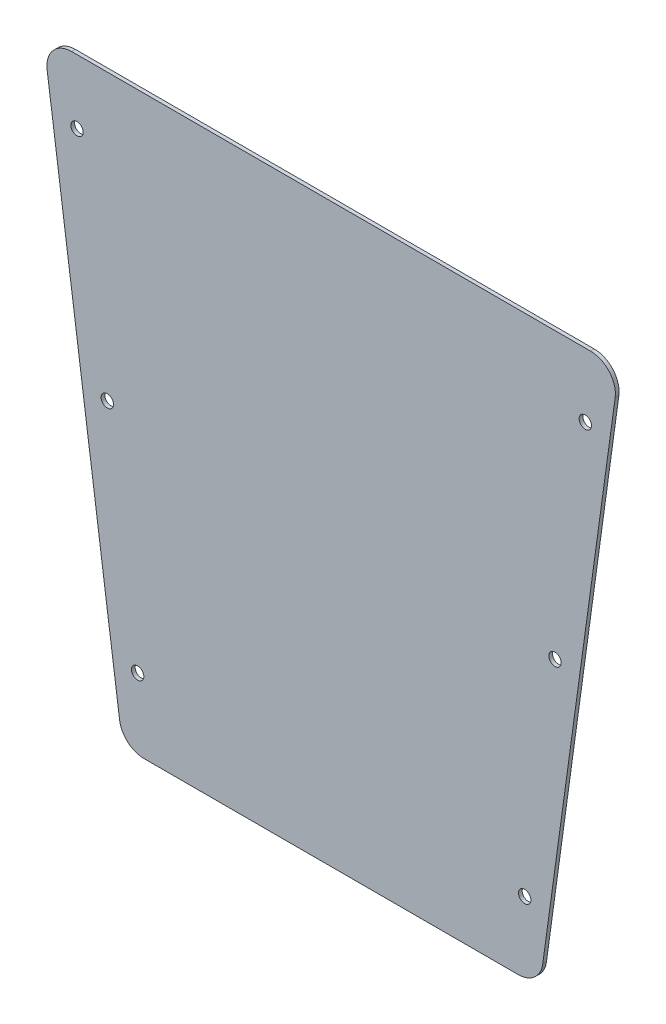
ISO-10303-21;
HEADER;
FILE_DESCRIPTION(('STEP AP214'),'2;1');
FILE_NAME('part.step','',(''),(''),'','','');
FILE_SCHEMA(('AUTOMOTIVE_DESIGN { 1 0 10303 214 1 1 1 1 }'));
ENDSEC;
DATA;
#1=APPLICATION_CONTEXT('core data for automotive mechanical design processes');
#2=APPLICATION_PROTOCOL_DEFINITION('international standard','automotive_design',2000,#1);
#3=PRODUCT_CONTEXT('',#1,'mechanical');
#4=PRODUCT('Part','Part','',(#3));
#5=PRODUCT_RELATED_PRODUCT_CATEGORY('part','',(#4));
#6=PRODUCT_DEFINITION_FORMATION('','',#4);
#7=PRODUCT_DEFINITION_CONTEXT('part definition',#1,'design');
#8=PRODUCT_DEFINITION('design','',#6,#7);
#9=PRODUCT_DEFINITION_SHAPE('','',#8);
#10=(LENGTH_UNIT() NAMED_UNIT(*) SI_UNIT(.MILLI.,.METRE.));
#11=(NAMED_UNIT(*) PLANE_ANGLE_UNIT() SI_UNIT($,.RADIAN.));
#12=(NAMED_UNIT(*) SI_UNIT($,.STERADIAN.) SOLID_ANGLE_UNIT());
#13=UNCERTAINTY_MEASURE_WITH_UNIT(LENGTH_MEASURE(1.E-05),#10,'distance_accuracy_value','');
#14=(GEOMETRIC_REPRESENTATION_CONTEXT(3) GLOBAL_UNCERTAINTY_ASSIGNED_CONTEXT((#13)) GLOBAL_UNIT_ASSIGNED_CONTEXT((#10,
#11,#12)) REPRESENTATION_CONTEXT('',''));
#15=CARTESIAN_POINT('',(0.,0.,0.));
#16=DIRECTION('',(0.,0.,1.));
#17=DIRECTION('',(1.,0.,0.));
#18=AXIS2_PLACEMENT_3D('',#15,#16,#17);
#19=CARTESIAN_POINT('',(84.3502994281403,-287.658470613836,-1.5));
#20=DIRECTION('',(0.990676879065413,-0.1362325999356,0.));
#21=DIRECTION('',(0.1362325999356,0.990676879065413,0.));
#22=AXIS2_PLACEMENT_3D('',#19,#20,#21);
#23=PLANE('',#22);
#24=DIRECTION('',(0.1362325999356,0.990676879065413,0.));
#25=VECTOR('',#24,1.);
#26=CARTESIAN_POINT('',(84.3502994281403,-287.658470613836,0.));
#27=LINE('',#26,#25);
#28=CARTESIAN_POINT('',(85.5381062815857,-279.020796613192,0.));
#29=VERTEX_POINT('',#28);
#30=CARTESIAN_POINT('',(114.81882264673,-66.0928431047569,0.));
#31=VERTEX_POINT('',#30);
#32=EDGE_CURVE('E204',#29,#31,#27,.T.);
#33=ORIENTED_EDGE('',*,*,#32,.F.);
#34=DIRECTION('',(0.,0.,1.));
#35=VECTOR('',#34,1.);
#36=CARTESIAN_POINT('',(85.5381062815857,-279.020796613192,-1.5));
#37=LINE('',#36,#35);
#38=CARTESIAN_POINT('',(85.5381062815857,-279.020796613192,-1.5));
#39=VERTEX_POINT('',#38);
#40=EDGE_CURVE('E158',#29,#39,#37,.F.);
#41=ORIENTED_EDGE('',*,*,#40,.T.);
#42=DIRECTION('',(0.1362325999356,0.990676879065413,0.));
#43=VECTOR('',#42,1.);
#44=CARTESIAN_POINT('',(84.3502994281403,-287.658470613836,-1.5));
#45=LINE('',#44,#43);
#46=CARTESIAN_POINT('',(114.81882264673,-66.0928431047569,-1.5));
#47=VERTEX_POINT('',#46);
#48=EDGE_CURVE('E131',#39,#47,#45,.T.);
#49=ORIENTED_EDGE('',*,*,#48,.T.);
#50=DIRECTION('',(0.,0.,1.));
#51=VECTOR('',#50,1.);
#52=CARTESIAN_POINT('',(114.81882264673,-66.0928431047568,-1.5));
#53=LINE('',#52,#51);
#54=EDGE_CURVE('E154',#47,#31,#53,.T.);
#55=ORIENTED_EDGE('',*,*,#54,.T.);
#56=EDGE_LOOP('',(#33,#41,#49,#55));
#57=FACE_BOUND('',#56,.T.);
#58=ADVANCED_FACE('F41',(#57),#23,.T.);
#59=CARTESIAN_POINT('',(-84.3502994281402,-287.658470613836,-1.5));
#60=DIRECTION('',(0.,-1.,0.));
#61=DIRECTION('',(0.,0.,-1.));
#62=AXIS2_PLACEMENT_3D('',#59,#60,#61);
#63=PLANE('',#62);
#64=DIRECTION('',(1.,0.,0.));
#65=VECTOR('',#64,1.);
#66=CARTESIAN_POINT('',(-84.3502994281402,-287.658470613836,-1.5));
#67=LINE('',#66,#65);
#68=CARTESIAN_POINT('',(-75.6313374909316,-287.658470613836,-1.5));
#69=VERTEX_POINT('',#68);
#70=CARTESIAN_POINT('',(75.6313374909316,-287.658470613836,-1.5));
#71=VERTEX_POINT('',#70);
#72=EDGE_CURVE('E137',#69,#71,#67,.T.);
#73=ORIENTED_EDGE('',*,*,#72,.T.);
#74=DIRECTION('',(0.,0.,1.));
#75=VECTOR('',#74,1.);
#76=CARTESIAN_POINT('',(75.6313374909316,-287.658470613836,-1.5));
#77=LINE('',#76,#75);
#78=CARTESIAN_POINT('',(75.6313374909316,-287.658470613836,0.));
#79=VERTEX_POINT('',#78);
#80=EDGE_CURVE('E129',#71,#79,#77,.T.);
#81=ORIENTED_EDGE('',*,*,#80,.T.);
#82=DIRECTION('',(1.,0.,0.));
#83=VECTOR('',#82,1.);
#84=CARTESIAN_POINT('',(-84.3502994281402,-287.658470613836,0.));
#85=LINE('',#84,#83);
#86=CARTESIAN_POINT('',(-75.6313374909316,-287.658470613836,0.));
#87=VERTEX_POINT('',#86);
#88=EDGE_CURVE('E111',#87,#79,#85,.T.);
#89=ORIENTED_EDGE('',*,*,#88,.F.);
#90=DIRECTION('',(0.,0.,1.));
#91=VECTOR('',#90,1.);
#92=CARTESIAN_POINT('',(-75.6313374909316,-287.658470613836,-1.5));
#93=LINE('',#92,#91);
#94=EDGE_CURVE('E126',#87,#69,#93,.F.);
#95=ORIENTED_EDGE('',*,*,#94,.T.);
#96=EDGE_LOOP('',(#73,#81,#89,#95));
#97=FACE_BOUND('',#96,.T.);
#98=ADVANCED_FACE('F125',(#97),#63,.T.);
#99=CARTESIAN_POINT('',(-116.381309109186,-54.7305171054008,-1.5));
#100=DIRECTION('',(-0.990676879065413,-0.1362325999356,0.));
#101=DIRECTION('',(0.1362325999356,-0.990676879065413,0.));
#102=AXIS2_PLACEMENT_3D('',#99,#100,#101);
#103=PLANE('',#102);
#104=DIRECTION('',(0.1362325999356,-0.990676879065413,0.));
#105=VECTOR('',#104,1.);
#106=CARTESIAN_POINT('',(-116.381309109186,-54.7305171054008,-1.5));
#107=LINE('',#106,#105);
#108=CARTESIAN_POINT('',(-114.81882264673,-66.0928431047568,-1.5));
#109=VERTEX_POINT('',#108);
#110=CARTESIAN_POINT('',(-85.5381062815857,-279.020796613191,-1.5));
#111=VERTEX_POINT('',#110);
#112=EDGE_CURVE('E144',#109,#111,#107,.T.);
#113=ORIENTED_EDGE('',*,*,#112,.T.);
#114=DIRECTION('',(0.,0.,1.));
#115=VECTOR('',#114,1.);
#116=CARTESIAN_POINT('',(-85.5381062815857,-279.020796613192,-1.5));
#117=LINE('',#116,#115);
#118=CARTESIAN_POINT('',(-85.5381062815857,-279.020796613191,0.));
#119=VERTEX_POINT('',#118);
#120=EDGE_CURVE('E174',#111,#119,#117,.T.);
#121=ORIENTED_EDGE('',*,*,#120,.T.);
#122=DIRECTION('',(0.1362325999356,-0.990676879065413,0.));
#123=VECTOR('',#122,1.);
#124=CARTESIAN_POINT('',(-116.381309109186,-54.7305171054008,0.));
#125=LINE('',#124,#123);
#126=CARTESIAN_POINT('',(-114.81882264673,-66.0928431047568,0.));
#127=VERTEX_POINT('',#126);
#128=EDGE_CURVE('E113',#127,#119,#125,.T.);
#129=ORIENTED_EDGE('',*,*,#128,.F.);
#130=DIRECTION('',(0.,0.,1.));
#131=VECTOR('',#130,1.);
#132=CARTESIAN_POINT('',(-114.81882264673,-66.0928431047568,-1.5));
#133=LINE('',#132,#131);
#134=EDGE_CURVE('E171',#127,#109,#133,.F.);
#135=ORIENTED_EDGE('',*,*,#134,.T.);
#136=EDGE_LOOP('',(#113,#121,#129,#135));
#137=FACE_BOUND('',#136,.T.);
#138=ADVANCED_FACE('F194',(#137),#103,.T.);
#139=CARTESIAN_POINT('',(116.381309109186,-54.7305171054008,-1.5));
#140=DIRECTION('',(0.,1.,0.));
#141=DIRECTION('',(-1.,0.,0.));
#142=AXIS2_PLACEMENT_3D('',#139,#140,#141);
#143=PLANE('',#142);
#144=DIRECTION('',(-1.,0.,0.));
#145=VECTOR('',#144,1.);
#146=CARTESIAN_POINT('',(116.381309109186,-54.7305171054008,-1.5));
#147=LINE('',#146,#145);
#148=CARTESIAN_POINT('',(104.912053856076,-54.7305171054008,-1.5));
#149=VERTEX_POINT('',#148);
#150=CARTESIAN_POINT('',(-104.912053856076,-54.7305171054008,-1.5));
#151=VERTEX_POINT('',#150);
#152=EDGE_CURVE('E197',#149,#151,#147,.T.);
#153=ORIENTED_EDGE('',*,*,#152,.T.);
#154=DIRECTION('',(0.,0.,1.));
#155=VECTOR('',#154,1.);
#156=CARTESIAN_POINT('',(-104.912053856076,-54.7305171054008,-1.5));
#157=LINE('',#156,#155);
#158=CARTESIAN_POINT('',(-104.912053856076,-54.7305171054008,0.));
#159=VERTEX_POINT('',#158);
#160=EDGE_CURVE('E11',#151,#159,#157,.T.);
#161=ORIENTED_EDGE('',*,*,#160,.T.);
#162=DIRECTION('',(-1.,0.,0.));
#163=VECTOR('',#162,1.);
#164=CARTESIAN_POINT('',(116.381309109186,-54.7305171054008,0.));
#165=LINE('',#164,#163);
#166=CARTESIAN_POINT('',(104.912053856076,-54.7305171054008,0.));
#167=VERTEX_POINT('',#166);
#168=EDGE_CURVE('E208',#167,#159,#165,.T.);
#169=ORIENTED_EDGE('',*,*,#168,.F.);
#170=DIRECTION('',(0.,0.,1.));
#171=VECTOR('',#170,1.);
#172=CARTESIAN_POINT('',(104.912053856076,-54.7305171054008,-1.5));
#173=LINE('',#172,#171);
#174=EDGE_CURVE('E50',#167,#149,#173,.F.);
#175=ORIENTED_EDGE('',*,*,#174,.T.);
#176=EDGE_LOOP('',(#153,#161,#169,#175));
#177=FACE_BOUND('',#176,.T.);
#178=ADVANCED_FACE('F289',(#177),#143,.T.);
#179=CARTESIAN_POINT('',(0.,0.,-1.5));
#180=DIRECTION('',(0.,0.,1.));
#181=DIRECTION('',(1.,0.,0.));
#182=AXIS2_PLACEMENT_3D('',#179,#180,#181);
#183=PLANE('',#182);
#184=CARTESIAN_POINT('',(102.757991696678,-80.676477357865,-1.5));
#185=DIRECTION('',(0.,0.,-1.));
#186=DIRECTION('',(-1.,0.,0.));
#187=AXIS2_PLACEMENT_3D('',#184,#185,#186);
#188=CIRCLE('',#187,2.5);
#189=CARTESIAN_POINT('',(100.257991696678,-80.676477357865,-1.5));
#190=VERTEX_POINT('',#189);
#191=EDGE_CURVE('E222',#190,#190,#188,.T.);
#192=ORIENTED_EDGE('',*,*,#191,.F.);
#193=EDGE_LOOP('',(#192));
#194=FACE_BOUND('',#193,.T.);
#195=CARTESIAN_POINT('',(-78.2361237082698,-258.998315589639,-1.5));
#196=DIRECTION('',(0.,0.,-1.));
#197=DIRECTION('',(-1.,0.,0.));
#198=AXIS2_PLACEMENT_3D('',#195,#196,#197);
#199=CIRCLE('',#198,2.50000000000001);
#200=CARTESIAN_POINT('',(-80.7361237082698,-258.998315589639,-1.5));
#201=VERTEX_POINT('',#200);
#202=EDGE_CURVE('E272',#201,#201,#199,.T.);
#203=ORIENTED_EDGE('',*,*,#202,.F.);
#204=EDGE_LOOP('',(#203));
#205=FACE_BOUND('',#204,.T.);
#206=CARTESIAN_POINT('',(-90.4970577024738,-169.837396473752,-1.5));
#207=DIRECTION('',(0.,0.,-1.));
#208=DIRECTION('',(-1.,0.,0.));
#209=AXIS2_PLACEMENT_3D('',#206,#207,#208);
#210=CIRCLE('',#209,2.5);
#211=CARTESIAN_POINT('',(-92.9970577024738,-169.837396473752,-1.5));
#212=VERTEX_POINT('',#211);
#213=EDGE_CURVE('E262',#212,#212,#210,.T.);
#214=ORIENTED_EDGE('',*,*,#213,.F.);
#215=EDGE_LOOP('',(#214));
#216=FACE_BOUND('',#215,.T.);
#217=CARTESIAN_POINT('',(-102.722754996678,-80.6716317948408,-1.5));
#218=DIRECTION('',(0.,0.,-1.));
#219=DIRECTION('',(-1.,0.,0.));
#220=AXIS2_PLACEMENT_3D('',#217,#218,#219);
#221=CIRCLE('',#220,2.5);
#222=CARTESIAN_POINT('',(-105.222754996678,-80.6716317948408,-1.5));
#223=VERTEX_POINT('',#222);
#224=EDGE_CURVE('E252',#223,#223,#221,.T.);
#225=ORIENTED_EDGE('',*,*,#224,.F.);
#226=EDGE_LOOP('',(#225));
#227=FACE_BOUND('',#226,.T.);
#228=CARTESIAN_POINT('',(78.2361237082698,-258.998315589639,-1.5));
#229=DIRECTION('',(0.,0.,-1.));
#230=DIRECTION('',(-1.,0.,0.));
#231=AXIS2_PLACEMENT_3D('',#228,#229,#230);
#232=CIRCLE('',#231,2.50000000000001);
#233=CARTESIAN_POINT('',(75.7361237082698,-258.998315589639,-1.5));
#234=VERTEX_POINT('',#233);
#235=EDGE_CURVE('E242',#234,#234,#232,.T.);
#236=ORIENTED_EDGE('',*,*,#235,.F.);
#237=EDGE_LOOP('',(#236));
#238=FACE_BOUND('',#237,.T.);
#239=CARTESIAN_POINT('',(90.4970577024738,-169.837396473752,-1.5));
#240=DIRECTION('',(0.,0.,-1.));
#241=DIRECTION('',(-1.,0.,0.));
#242=AXIS2_PLACEMENT_3D('',#239,#240,#241);
#243=CIRCLE('',#242,2.5);
#244=CARTESIAN_POINT('',(87.9970577024738,-169.837396473752,-1.5));
#245=VERTEX_POINT('',#244);
#246=EDGE_CURVE('E232',#245,#245,#243,.T.);
#247=ORIENTED_EDGE('',*,*,#246,.F.);
#248=EDGE_LOOP('',(#247));
#249=FACE_BOUND('',#248,.T.);
#250=ORIENTED_EDGE('',*,*,#48,.F.);
#251=CARTESIAN_POINT('',(75.6313374909316,-277.658470613836,-1.5));
#252=DIRECTION('',(0.,0.,1.));
#253=DIRECTION('',(1.,0.,0.));
#254=AXIS2_PLACEMENT_3D('',#251,#252,#253);
#255=CIRCLE('',#254,10.);
#256=EDGE_CURVE('E168',#39,#71,#255,.F.);
#257=ORIENTED_EDGE('',*,*,#256,.T.);
#258=ORIENTED_EDGE('',*,*,#72,.F.);
#259=CARTESIAN_POINT('',(-75.6313374909316,-277.658470613836,-1.5));
#260=DIRECTION('',(0.,0.,1.));
#261=DIRECTION('',(1.,0.,0.));
#262=AXIS2_PLACEMENT_3D('',#259,#260,#261);
#263=CIRCLE('',#262,10.);
#264=EDGE_CURVE('E135',#69,#111,#263,.F.);
#265=ORIENTED_EDGE('',*,*,#264,.T.);
#266=ORIENTED_EDGE('',*,*,#112,.F.);
#267=CARTESIAN_POINT('',(-104.912053856076,-64.7305171054008,-1.5));
#268=DIRECTION('',(0.,0.,1.));
#269=DIRECTION('',(1.,0.,0.));
#270=AXIS2_PLACEMENT_3D('',#267,#268,#269);
#271=CIRCLE('',#270,10.);
#272=EDGE_CURVE('E57',#109,#151,#271,.F.);
#273=ORIENTED_EDGE('',*,*,#272,.T.);
#274=ORIENTED_EDGE('',*,*,#152,.F.);
#275=CARTESIAN_POINT('',(104.912053856076,-64.7305171054008,-1.5));
#276=DIRECTION('',(0.,0.,1.));
#277=DIRECTION('',(1.,0.,0.));
#278=AXIS2_PLACEMENT_3D('',#275,#276,#277);
#279=CIRCLE('',#278,10.);
#280=EDGE_CURVE('E161',#149,#47,#279,.F.);
#281=ORIENTED_EDGE('',*,*,#280,.T.);
#282=EDGE_LOOP('',(#250,#257,#258,#265,#266,#273,#274,#281));
#283=FACE_BOUND('',#282,.T.);
#284=ADVANCED_FACE('F315',(#194,#205,#216,#227,#238,#249,#283),#183,.F.);
#285=CARTESIAN_POINT('',(0.,0.,0.));
#286=DIRECTION('',(0.,0.,1.));
#287=DIRECTION('',(1.,0.,0.));
#288=AXIS2_PLACEMENT_3D('',#285,#286,#287);
#289=PLANE('',#288);
#290=CARTESIAN_POINT('',(102.757991696678,-80.676477357865,0.));
#291=DIRECTION('',(0.,0.,-1.));
#292=DIRECTION('',(-1.,0.,0.));
#293=AXIS2_PLACEMENT_3D('',#290,#291,#292);
#294=CIRCLE('',#293,2.5);
#295=CARTESIAN_POINT('',(100.257991696678,-80.676477357865,0.));
#296=VERTEX_POINT('',#295);
#297=EDGE_CURVE('E209',#296,#296,#294,.T.);
#298=ORIENTED_EDGE('',*,*,#297,.T.);
#299=EDGE_LOOP('',(#298));
#300=FACE_BOUND('',#299,.T.);
#301=CARTESIAN_POINT('',(-78.2361237082698,-258.998315589639,0.));
#302=DIRECTION('',(0.,0.,-1.));
#303=DIRECTION('',(-1.,0.,0.));
#304=AXIS2_PLACEMENT_3D('',#301,#302,#303);
#305=CIRCLE('',#304,2.50000000000001);
#306=CARTESIAN_POINT('',(-80.7361237082698,-258.998315589639,0.));
#307=VERTEX_POINT('',#306);
#308=EDGE_CURVE('E267',#307,#307,#305,.T.);
#309=ORIENTED_EDGE('',*,*,#308,.T.);
#310=EDGE_LOOP('',(#309));
#311=FACE_BOUND('',#310,.T.);
#312=CARTESIAN_POINT('',(-90.4970577024738,-169.837396473752,0.));
#313=DIRECTION('',(0.,0.,-1.));
#314=DIRECTION('',(-1.,0.,0.));
#315=AXIS2_PLACEMENT_3D('',#312,#313,#314);
#316=CIRCLE('',#315,2.5);
#317=CARTESIAN_POINT('',(-92.9970577024738,-169.837396473752,0.));
#318=VERTEX_POINT('',#317);
#319=EDGE_CURVE('E257',#318,#318,#316,.T.);
#320=ORIENTED_EDGE('',*,*,#319,.T.);
#321=EDGE_LOOP('',(#320));
#322=FACE_BOUND('',#321,.T.);
#323=CARTESIAN_POINT('',(-102.722754996678,-80.6716317948408,0.));
#324=DIRECTION('',(0.,0.,-1.));
#325=DIRECTION('',(-1.,0.,0.));
#326=AXIS2_PLACEMENT_3D('',#323,#324,#325);
#327=CIRCLE('',#326,2.5);
#328=CARTESIAN_POINT('',(-105.222754996678,-80.6716317948408,0.));
#329=VERTEX_POINT('',#328);
#330=EDGE_CURVE('E247',#329,#329,#327,.T.);
#331=ORIENTED_EDGE('',*,*,#330,.T.);
#332=EDGE_LOOP('',(#331));
#333=FACE_BOUND('',#332,.T.);
#334=CARTESIAN_POINT('',(78.2361237082698,-258.998315589639,0.));
#335=DIRECTION('',(0.,0.,-1.));
#336=DIRECTION('',(-1.,0.,0.));
#337=AXIS2_PLACEMENT_3D('',#334,#335,#336);
#338=CIRCLE('',#337,2.50000000000001);
#339=CARTESIAN_POINT('',(75.7361237082698,-258.998315589639,0.));
#340=VERTEX_POINT('',#339);
#341=EDGE_CURVE('E237',#340,#340,#338,.T.);
#342=ORIENTED_EDGE('',*,*,#341,.T.);
#343=EDGE_LOOP('',(#342));
#344=FACE_BOUND('',#343,.T.);
#345=CARTESIAN_POINT('',(90.4970577024738,-169.837396473752,0.));
#346=DIRECTION('',(0.,0.,-1.));
#347=DIRECTION('',(-1.,0.,0.));
#348=AXIS2_PLACEMENT_3D('',#345,#346,#347);
#349=CIRCLE('',#348,2.5);
#350=CARTESIAN_POINT('',(87.9970577024738,-169.837396473752,0.));
#351=VERTEX_POINT('',#350);
#352=EDGE_CURVE('E227',#351,#351,#349,.T.);
#353=ORIENTED_EDGE('',*,*,#352,.T.);
#354=EDGE_LOOP('',(#353));
#355=FACE_BOUND('',#354,.T.);
#356=ORIENTED_EDGE('',*,*,#88,.T.);
#357=CARTESIAN_POINT('',(75.6313374909316,-277.658470613836,0.));
#358=DIRECTION('',(0.,0.,1.));
#359=DIRECTION('',(1.,0.,0.));
#360=AXIS2_PLACEMENT_3D('',#357,#358,#359);
#361=CIRCLE('',#360,10.);
#362=EDGE_CURVE('E119',#79,#29,#361,.T.);
#363=ORIENTED_EDGE('',*,*,#362,.T.);
#364=ORIENTED_EDGE('',*,*,#32,.T.);
#365=CARTESIAN_POINT('',(104.912053856076,-64.7305171054008,0.));
#366=DIRECTION('',(0.,0.,1.));
#367=DIRECTION('',(1.,0.,0.));
#368=AXIS2_PLACEMENT_3D('',#365,#366,#367);
#369=CIRCLE('',#368,10.);
#370=EDGE_CURVE('E142',#31,#167,#369,.T.);
#371=ORIENTED_EDGE('',*,*,#370,.T.);
#372=ORIENTED_EDGE('',*,*,#168,.T.);
#373=CARTESIAN_POINT('',(-104.912053856076,-64.7305171054008,0.));
#374=DIRECTION('',(0.,0.,1.));
#375=DIRECTION('',(1.,0.,0.));
#376=AXIS2_PLACEMENT_3D('',#373,#374,#375);
#377=CIRCLE('',#376,10.);
#378=EDGE_CURVE('E120',#159,#127,#377,.T.);
#379=ORIENTED_EDGE('',*,*,#378,.T.);
#380=ORIENTED_EDGE('',*,*,#128,.T.);
#381=CARTESIAN_POINT('',(-75.6313374909316,-277.658470613836,0.));
#382=DIRECTION('',(0.,0.,1.));
#383=DIRECTION('',(1.,0.,0.));
#384=AXIS2_PLACEMENT_3D('',#381,#382,#383);
#385=CIRCLE('',#384,10.);
#386=EDGE_CURVE('E108',#119,#87,#385,.T.);
#387=ORIENTED_EDGE('',*,*,#386,.T.);
#388=EDGE_LOOP('',(#356,#363,#364,#371,#372,#379,#380,#387));
#389=FACE_BOUND('',#388,.T.);
#390=ADVANCED_FACE('F110',(#300,#311,#322,#333,#344,#355,#389),#289,.T.);
#391=CARTESIAN_POINT('',(75.6313374909316,-277.658470613836,-1.5));
#392=DIRECTION('',(0.,0.,1.));
#393=DIRECTION('',(1.,0.,0.));
#394=AXIS2_PLACEMENT_3D('',#391,#392,#393);
#395=CYLINDRICAL_SURFACE('',#394,10.);
#396=ORIENTED_EDGE('',*,*,#256,.F.);
#397=ORIENTED_EDGE('',*,*,#40,.F.);
#398=ORIENTED_EDGE('',*,*,#362,.F.);
#399=ORIENTED_EDGE('',*,*,#80,.F.);
#400=EDGE_LOOP('',(#396,#397,#398,#399));
#401=FACE_BOUND('',#400,.T.);
#402=ADVANCED_FACE('F299',(#401),#395,.T.);
#403=CARTESIAN_POINT('',(-75.6313374909316,-277.658470613836,-1.5));
#404=DIRECTION('',(0.,0.,1.));
#405=DIRECTION('',(1.,0.,0.));
#406=AXIS2_PLACEMENT_3D('',#403,#404,#405);
#407=CYLINDRICAL_SURFACE('',#406,10.);
#408=ORIENTED_EDGE('',*,*,#264,.F.);
#409=ORIENTED_EDGE('',*,*,#94,.F.);
#410=ORIENTED_EDGE('',*,*,#386,.F.);
#411=ORIENTED_EDGE('',*,*,#120,.F.);
#412=EDGE_LOOP('',(#408,#409,#410,#411));
#413=FACE_BOUND('',#412,.T.);
#414=ADVANCED_FACE('F134',(#413),#407,.T.);
#415=CARTESIAN_POINT('',(-104.912053856076,-64.7305171054008,-1.5));
#416=DIRECTION('',(0.,0.,1.));
#417=DIRECTION('',(1.,0.,0.));
#418=AXIS2_PLACEMENT_3D('',#415,#416,#417);
#419=CYLINDRICAL_SURFACE('',#418,10.);
#420=ORIENTED_EDGE('',*,*,#272,.F.);
#421=ORIENTED_EDGE('',*,*,#134,.F.);
#422=ORIENTED_EDGE('',*,*,#378,.F.);
#423=ORIENTED_EDGE('',*,*,#160,.F.);
#424=EDGE_LOOP('',(#420,#421,#422,#423));
#425=FACE_BOUND('',#424,.T.);
#426=ADVANCED_FACE('F292',(#425),#419,.T.);
#427=CARTESIAN_POINT('',(104.912053856076,-64.7305171054008,-1.5));
#428=DIRECTION('',(0.,0.,1.));
#429=DIRECTION('',(1.,0.,0.));
#430=AXIS2_PLACEMENT_3D('',#427,#428,#429);
#431=CYLINDRICAL_SURFACE('',#430,10.);
#432=ORIENTED_EDGE('',*,*,#280,.F.);
#433=ORIENTED_EDGE('',*,*,#174,.F.);
#434=ORIENTED_EDGE('',*,*,#370,.F.);
#435=ORIENTED_EDGE('',*,*,#54,.F.);
#436=EDGE_LOOP('',(#432,#433,#434,#435));
#437=FACE_BOUND('',#436,.T.);
#438=ADVANCED_FACE('F43',(#437),#431,.T.);
#439=CARTESIAN_POINT('',(90.4970577024738,-169.837396473752,0.));
#440=DIRECTION('',(0.,0.,-1.));
#441=DIRECTION('',(-1.,0.,0.));
#442=AXIS2_PLACEMENT_3D('',#439,#440,#441);
#443=CYLINDRICAL_SURFACE('',#442,2.5);
#444=ORIENTED_EDGE('',*,*,#352,.F.);
#445=EDGE_LOOP('',(#444));
#446=FACE_BOUND('',#445,.T.);
#447=ORIENTED_EDGE('',*,*,#246,.T.);
#448=EDGE_LOOP('',(#447));
#449=FACE_BOUND('',#448,.T.);
#450=ADVANCED_FACE('F298',(#446,#449),#443,.F.);
#451=CARTESIAN_POINT('',(78.2361237082698,-258.998315589639,0.));
#452=DIRECTION('',(0.,0.,-1.));
#453=DIRECTION('',(-1.,0.,0.));
#454=AXIS2_PLACEMENT_3D('',#451,#452,#453);
#455=CYLINDRICAL_SURFACE('',#454,2.50000000000001);
#456=ORIENTED_EDGE('',*,*,#341,.F.);
#457=EDGE_LOOP('',(#456));
#458=FACE_BOUND('',#457,.T.);
#459=ORIENTED_EDGE('',*,*,#235,.T.);
#460=EDGE_LOOP('',(#459));
#461=FACE_BOUND('',#460,.T.);
#462=ADVANCED_FACE('F377',(#458,#461),#455,.F.);
#463=CARTESIAN_POINT('',(-102.722754996678,-80.6716317948408,0.));
#464=DIRECTION('',(0.,0.,-1.));
#465=DIRECTION('',(-1.,0.,0.));
#466=AXIS2_PLACEMENT_3D('',#463,#464,#465);
#467=CYLINDRICAL_SURFACE('',#466,2.5);
#468=ORIENTED_EDGE('',*,*,#330,.F.);
#469=EDGE_LOOP('',(#468));
#470=FACE_BOUND('',#469,.T.);
#471=ORIENTED_EDGE('',*,*,#224,.T.);
#472=EDGE_LOOP('',(#471));
#473=FACE_BOUND('',#472,.T.);
#474=ADVANCED_FACE('F387',(#470,#473),#467,.F.);
#475=CARTESIAN_POINT('',(-90.4970577024738,-169.837396473752,0.));
#476=DIRECTION('',(0.,0.,-1.));
#477=DIRECTION('',(-1.,0.,0.));
#478=AXIS2_PLACEMENT_3D('',#475,#476,#477);
#479=CYLINDRICAL_SURFACE('',#478,2.5);
#480=ORIENTED_EDGE('',*,*,#319,.F.);
#481=EDGE_LOOP('',(#480));
#482=FACE_BOUND('',#481,.T.);
#483=ORIENTED_EDGE('',*,*,#213,.T.);
#484=EDGE_LOOP('',(#483));
#485=FACE_BOUND('',#484,.T.);
#486=ADVANCED_FACE('F327',(#482,#485),#479,.F.);
#487=CARTESIAN_POINT('',(-78.2361237082698,-258.998315589639,0.));
#488=DIRECTION('',(0.,0.,-1.));
#489=DIRECTION('',(-1.,0.,0.));
#490=AXIS2_PLACEMENT_3D('',#487,#488,#489);
#491=CYLINDRICAL_SURFACE('',#490,2.50000000000001);
#492=ORIENTED_EDGE('',*,*,#308,.F.);
#493=EDGE_LOOP('',(#492));
#494=FACE_BOUND('',#493,.T.);
#495=ORIENTED_EDGE('',*,*,#202,.T.);
#496=EDGE_LOOP('',(#495));
#497=FACE_BOUND('',#496,.T.);
#498=ADVANCED_FACE('F405',(#494,#497),#491,.F.);
#499=CARTESIAN_POINT('',(102.757991696678,-80.676477357865,0.));
#500=DIRECTION('',(0.,0.,-1.));
#501=DIRECTION('',(-1.,0.,0.));
#502=AXIS2_PLACEMENT_3D('',#499,#500,#501);
#503=CYLINDRICAL_SURFACE('',#502,2.5);
#504=ORIENTED_EDGE('',*,*,#297,.F.);
#505=EDGE_LOOP('',(#504));
#506=FACE_BOUND('',#505,.T.);
#507=ORIENTED_EDGE('',*,*,#191,.T.);
#508=EDGE_LOOP('',(#507));
#509=FACE_BOUND('',#508,.T.);
#510=ADVANCED_FACE('F414',(#506,#509),#503,.F.);
#511=CLOSED_SHELL('',(#58,#98,#138,#178,#284,#390,#402,#414,#426,#438,#450,#462,#474,#486,#498,#510));
#512=MANIFOLD_SOLID_BREP('B2',#511);
#513=ADVANCED_BREP_SHAPE_REPRESENTATION('',(#18,#512),#14);
#514=SHAPE_DEFINITION_REPRESENTATION(#9,#513);
ENDSEC;
END-ISO-10303-21;
